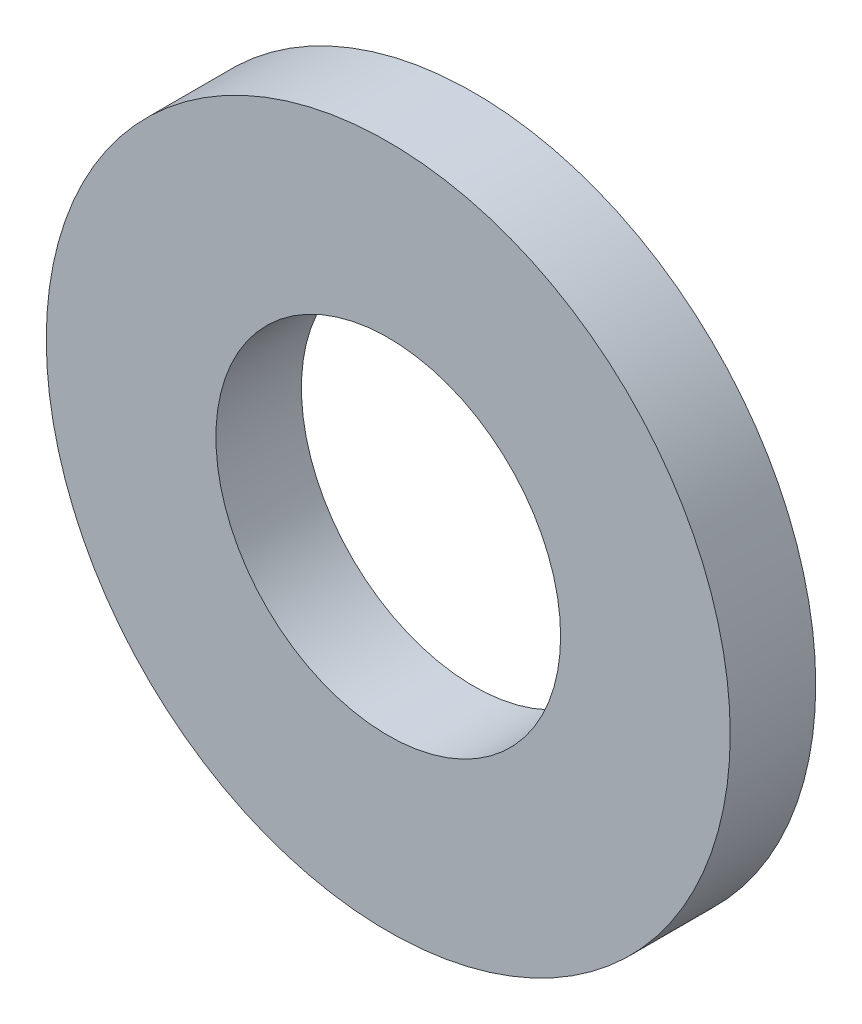
ISO-10303-21;
HEADER;
FILE_DESCRIPTION(('STEP AP214'),'2;1');
FILE_NAME('part.step','',(''),(''),'','','');
FILE_SCHEMA(('AUTOMOTIVE_DESIGN { 1 0 10303 214 1 1 1 1 }'));
ENDSEC;
DATA;
#1=APPLICATION_CONTEXT('core data for automotive mechanical design processes');
#2=APPLICATION_PROTOCOL_DEFINITION('international standard','automotive_design',2000,#1);
#3=PRODUCT_CONTEXT('',#1,'mechanical');
#4=PRODUCT('Part','Part','',(#3));
#5=PRODUCT_RELATED_PRODUCT_CATEGORY('part','',(#4));
#6=PRODUCT_DEFINITION_FORMATION('','',#4);
#7=PRODUCT_DEFINITION_CONTEXT('part definition',#1,'design');
#8=PRODUCT_DEFINITION('design','',#6,#7);
#9=PRODUCT_DEFINITION_SHAPE('','',#8);
#10=(LENGTH_UNIT() NAMED_UNIT(*) SI_UNIT(.MILLI.,.METRE.));
#11=(NAMED_UNIT(*) PLANE_ANGLE_UNIT() SI_UNIT($,.RADIAN.));
#12=(NAMED_UNIT(*) SI_UNIT($,.STERADIAN.) SOLID_ANGLE_UNIT());
#13=UNCERTAINTY_MEASURE_WITH_UNIT(LENGTH_MEASURE(1.E-05),#10,'distance_accuracy_value','');
#14=(GEOMETRIC_REPRESENTATION_CONTEXT(3) GLOBAL_UNCERTAINTY_ASSIGNED_CONTEXT((#13)) GLOBAL_UNIT_ASSIGNED_CONTEXT((#10,
#11,#12)) REPRESENTATION_CONTEXT('',''));
#15=CARTESIAN_POINT('',(0.,0.,0.));
#16=DIRECTION('',(0.,0.,1.));
#17=DIRECTION('',(1.,0.,0.));
#18=AXIS2_PLACEMENT_3D('',#15,#16,#17);
#19=CARTESIAN_POINT('',(0.,0.,0.79375));
#20=DIRECTION('',(0.,0.,1.));
#21=DIRECTION('',(1.,0.,0.));
#22=AXIS2_PLACEMENT_3D('',#19,#20,#21);
#23=PLANE('',#22);
#24=CARTESIAN_POINT('',(0.,0.,0.79375));
#25=DIRECTION('',(0.,0.,1.));
#26=DIRECTION('',(1.,0.,0.));
#27=AXIS2_PLACEMENT_3D('',#24,#25,#26);
#28=CIRCLE('',#27,6.35);
#29=CARTESIAN_POINT('',(6.35,0.,0.79375));
#30=VERTEX_POINT('',#29);
#31=EDGE_CURVE('E10',#30,#30,#28,.T.);
#32=ORIENTED_EDGE('',*,*,#31,.T.);
#33=EDGE_LOOP('',(#32));
#34=FACE_BOUND('',#33,.T.);
#35=CARTESIAN_POINT('',(0.,0.,0.79375));
#36=DIRECTION('',(0.,0.,1.));
#37=DIRECTION('',(1.,0.,0.));
#38=AXIS2_PLACEMENT_3D('',#35,#36,#37);
#39=CIRCLE('',#38,3.2004);
#40=CARTESIAN_POINT('',(3.2004,0.,0.79375));
#41=VERTEX_POINT('',#40);
#42=EDGE_CURVE('E44',#41,#41,#39,.T.);
#43=ORIENTED_EDGE('',*,*,#42,.F.);
#44=EDGE_LOOP('',(#43));
#45=FACE_BOUND('',#44,.T.);
#46=ADVANCED_FACE('F33',(#34,#45),#23,.T.);
#47=CARTESIAN_POINT('',(0.,0.,-0.79375));
#48=DIRECTION('',(0.,0.,1.));
#49=DIRECTION('',(1.,0.,0.));
#50=AXIS2_PLACEMENT_3D('',#47,#48,#49);
#51=PLANE('',#50);
#52=CARTESIAN_POINT('',(0.,0.,-0.79375));
#53=DIRECTION('',(0.,0.,1.));
#54=DIRECTION('',(1.,0.,0.));
#55=AXIS2_PLACEMENT_3D('',#52,#53,#54);
#56=CIRCLE('',#55,6.35);
#57=CARTESIAN_POINT('',(6.35,0.,-0.79375));
#58=VERTEX_POINT('',#57);
#59=EDGE_CURVE('E37',#58,#58,#56,.T.);
#60=ORIENTED_EDGE('',*,*,#59,.F.);
#61=EDGE_LOOP('',(#60));
#62=FACE_BOUND('',#61,.T.);
#63=CARTESIAN_POINT('',(0.,0.,-0.79375));
#64=DIRECTION('',(0.,0.,1.));
#65=DIRECTION('',(1.,0.,0.));
#66=AXIS2_PLACEMENT_3D('',#63,#64,#65);
#67=CIRCLE('',#66,3.2004);
#68=CARTESIAN_POINT('',(3.2004,0.,-0.79375));
#69=VERTEX_POINT('',#68);
#70=EDGE_CURVE('E46',#69,#69,#67,.T.);
#71=ORIENTED_EDGE('',*,*,#70,.T.);
#72=EDGE_LOOP('',(#71));
#73=FACE_BOUND('',#72,.T.);
#74=ADVANCED_FACE('F56',(#62,#73),#51,.F.);
#75=CARTESIAN_POINT('',(0.,0.,0.79375));
#76=DIRECTION('',(0.,0.,-1.));
#77=DIRECTION('',(-1.,0.,0.));
#78=AXIS2_PLACEMENT_3D('',#75,#76,#77);
#79=CYLINDRICAL_SURFACE('',#78,6.35);
#80=ORIENTED_EDGE('',*,*,#31,.F.);
#81=EDGE_LOOP('',(#80));
#82=FACE_BOUND('',#81,.T.);
#83=ORIENTED_EDGE('',*,*,#59,.T.);
#84=EDGE_LOOP('',(#83));
#85=FACE_BOUND('',#84,.T.);
#86=ADVANCED_FACE('F35',(#82,#85),#79,.T.);
#87=CARTESIAN_POINT('',(0.,0.,0.79375));
#88=DIRECTION('',(0.,0.,-1.));
#89=DIRECTION('',(-1.,0.,0.));
#90=AXIS2_PLACEMENT_3D('',#87,#88,#89);
#91=CYLINDRICAL_SURFACE('',#90,3.2004);
#92=ORIENTED_EDGE('',*,*,#42,.T.);
#93=EDGE_LOOP('',(#92));
#94=FACE_BOUND('',#93,.T.);
#95=ORIENTED_EDGE('',*,*,#70,.F.);
#96=EDGE_LOOP('',(#95));
#97=FACE_BOUND('',#96,.T.);
#98=ADVANCED_FACE('F52',(#94,#97),#91,.F.);
#99=CLOSED_SHELL('',(#46,#74,#86,#98));
#100=MANIFOLD_SOLID_BREP('B2',#99);
#101=ADVANCED_BREP_SHAPE_REPRESENTATION('',(#18,#100),#14);
#102=SHAPE_DEFINITION_REPRESENTATION(#9,#101);
ENDSEC;
END-ISO-10303-21;
